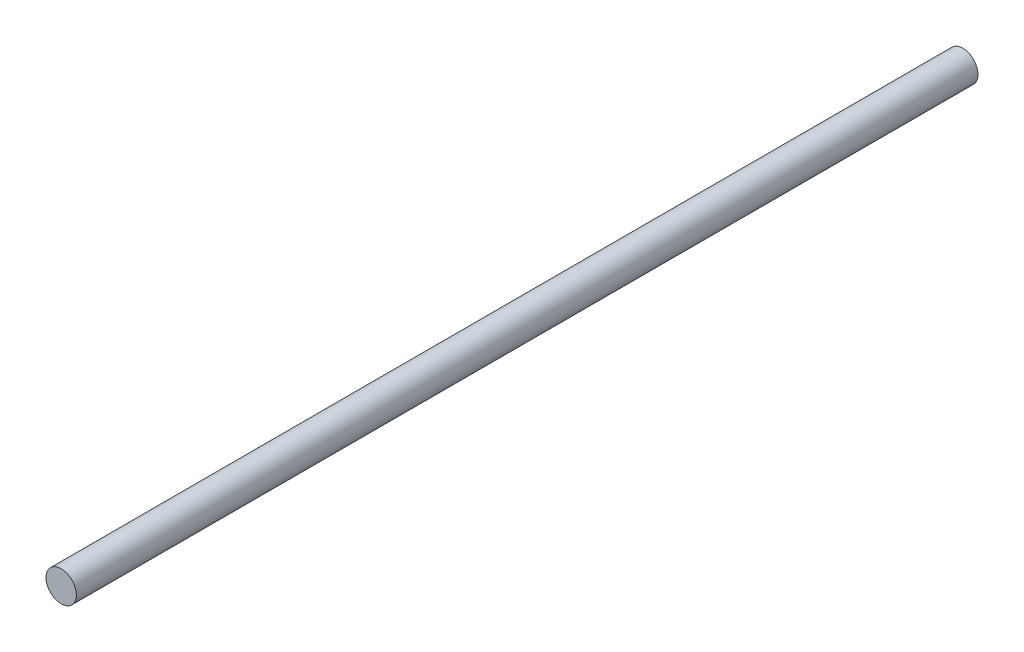
ISO-10303-21;
HEADER;
FILE_DESCRIPTION(('STEP AP214'),'2;1');
FILE_NAME('part.step','',(''),(''),'','','');
FILE_SCHEMA(('AUTOMOTIVE_DESIGN { 1 0 10303 214 1 1 1 1 }'));
ENDSEC;
DATA;
#1=APPLICATION_CONTEXT('core data for automotive mechanical design processes');
#2=APPLICATION_PROTOCOL_DEFINITION('international standard','automotive_design',2000,#1);
#3=PRODUCT_CONTEXT('',#1,'mechanical');
#4=PRODUCT('Part','Part','',(#3));
#5=PRODUCT_RELATED_PRODUCT_CATEGORY('part','',(#4));
#6=PRODUCT_DEFINITION_FORMATION('','',#4);
#7=PRODUCT_DEFINITION_CONTEXT('part definition',#1,'design');
#8=PRODUCT_DEFINITION('design','',#6,#7);
#9=PRODUCT_DEFINITION_SHAPE('','',#8);
#10=(LENGTH_UNIT() NAMED_UNIT(*) SI_UNIT(.MILLI.,.METRE.));
#11=(NAMED_UNIT(*) PLANE_ANGLE_UNIT() SI_UNIT($,.RADIAN.));
#12=(NAMED_UNIT(*) SI_UNIT($,.STERADIAN.) SOLID_ANGLE_UNIT());
#13=UNCERTAINTY_MEASURE_WITH_UNIT(LENGTH_MEASURE(1.E-05),#10,'distance_accuracy_value','');
#14=(GEOMETRIC_REPRESENTATION_CONTEXT(3) GLOBAL_UNCERTAINTY_ASSIGNED_CONTEXT((#13)) GLOBAL_UNIT_ASSIGNED_CONTEXT((#10,
#11,#12)) REPRESENTATION_CONTEXT('',''));
#15=CARTESIAN_POINT('',(0.,0.,0.));
#16=DIRECTION('',(0.,0.,1.));
#17=DIRECTION('',(1.,0.,0.));
#18=AXIS2_PLACEMENT_3D('',#15,#16,#17);
#19=CARTESIAN_POINT('',(0.,0.,89.));
#20=DIRECTION('',(0.,0.,-1.));
#21=DIRECTION('',(-1.,0.,0.));
#22=AXIS2_PLACEMENT_3D('',#19,#20,#21);
#23=CYLINDRICAL_SURFACE('',#22,1.5);
#24=CARTESIAN_POINT('',(0.,0.,89.));
#25=DIRECTION('',(0.,0.,1.));
#26=DIRECTION('',(1.,0.,0.));
#27=AXIS2_PLACEMENT_3D('',#24,#25,#26);
#28=CIRCLE('',#27,1.5);
#29=CARTESIAN_POINT('',(1.5,0.,89.));
#30=VERTEX_POINT('',#29);
#31=EDGE_CURVE('E10',#30,#30,#28,.T.);
#32=ORIENTED_EDGE('',*,*,#31,.F.);
#33=EDGE_LOOP('',(#32));
#34=FACE_BOUND('',#33,.T.);
#35=CARTESIAN_POINT('',(0.,0.,0.));
#36=DIRECTION('',(0.,0.,1.));
#37=DIRECTION('',(1.,0.,0.));
#38=AXIS2_PLACEMENT_3D('',#35,#36,#37);
#39=CIRCLE('',#38,1.5);
#40=CARTESIAN_POINT('',(1.5,0.,0.));
#41=VERTEX_POINT('',#40);
#42=EDGE_CURVE('E34',#41,#41,#39,.T.);
#43=ORIENTED_EDGE('',*,*,#42,.T.);
#44=EDGE_LOOP('',(#43));
#45=FACE_BOUND('',#44,.T.);
#46=ADVANCED_FACE('F31',(#34,#45),#23,.T.);
#47=CARTESIAN_POINT('',(0.,0.,89.));
#48=DIRECTION('',(0.,0.,1.));
#49=DIRECTION('',(1.,0.,0.));
#50=AXIS2_PLACEMENT_3D('',#47,#48,#49);
#51=PLANE('',#50);
#52=ORIENTED_EDGE('',*,*,#31,.T.);
#53=EDGE_LOOP('',(#52));
#54=FACE_BOUND('',#53,.T.);
#55=ADVANCED_FACE('F46',(#54),#51,.T.);
#56=CARTESIAN_POINT('',(0.,0.,0.));
#57=DIRECTION('',(0.,0.,1.));
#58=DIRECTION('',(1.,0.,0.));
#59=AXIS2_PLACEMENT_3D('',#56,#57,#58);
#60=PLANE('',#59);
#61=ORIENTED_EDGE('',*,*,#42,.F.);
#62=EDGE_LOOP('',(#61));
#63=FACE_BOUND('',#62,.T.);
#64=ADVANCED_FACE('F44',(#63),#60,.F.);
#65=CLOSED_SHELL('',(#46,#55,#64));
#66=MANIFOLD_SOLID_BREP('B2',#65);
#67=ADVANCED_BREP_SHAPE_REPRESENTATION('',(#18,#66),#14);
#68=SHAPE_DEFINITION_REPRESENTATION(#9,#67);
ENDSEC;
END-ISO-10303-21;
